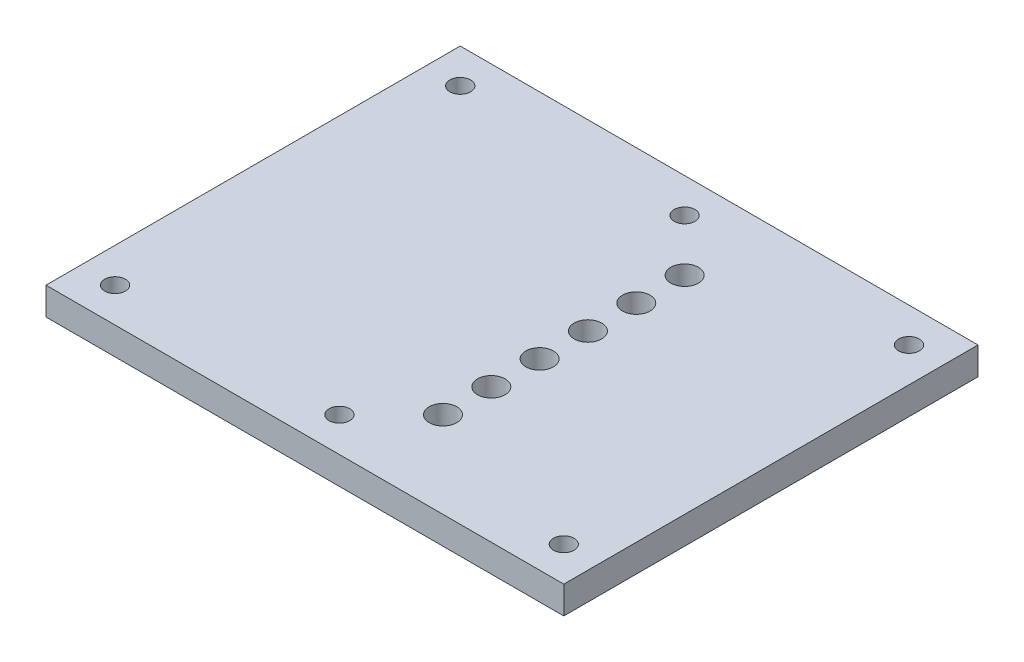
ISO-10303-21;
HEADER;
FILE_DESCRIPTION(('STEP AP214'),'2;1');
FILE_NAME('part.step','',(''),(''),'','','');
FILE_SCHEMA(('AUTOMOTIVE_DESIGN { 1 0 10303 214 1 1 1 1 }'));
ENDSEC;
DATA;
#1=APPLICATION_CONTEXT('core data for automotive mechanical design processes');
#2=APPLICATION_PROTOCOL_DEFINITION('international standard','automotive_design',2000,#1);
#3=PRODUCT_CONTEXT('',#1,'mechanical');
#4=PRODUCT('Part','Part','',(#3));
#5=PRODUCT_RELATED_PRODUCT_CATEGORY('part','',(#4));
#6=PRODUCT_DEFINITION_FORMATION('','',#4);
#7=PRODUCT_DEFINITION_CONTEXT('part definition',#1,'design');
#8=PRODUCT_DEFINITION('design','',#6,#7);
#9=PRODUCT_DEFINITION_SHAPE('','',#8);
#10=(LENGTH_UNIT() NAMED_UNIT(*) SI_UNIT(.MILLI.,.METRE.));
#11=(NAMED_UNIT(*) PLANE_ANGLE_UNIT() SI_UNIT($,.RADIAN.));
#12=(NAMED_UNIT(*) SI_UNIT($,.STERADIAN.) SOLID_ANGLE_UNIT());
#13=UNCERTAINTY_MEASURE_WITH_UNIT(LENGTH_MEASURE(1.E-05),#10,'distance_accuracy_value','');
#14=(GEOMETRIC_REPRESENTATION_CONTEXT(3) GLOBAL_UNCERTAINTY_ASSIGNED_CONTEXT((#13)) GLOBAL_UNIT_ASSIGNED_CONTEXT((#10,
#11,#12)) REPRESENTATION_CONTEXT('',''));
#15=CARTESIAN_POINT('',(0.,0.,0.));
#16=DIRECTION('',(0.,0.,1.));
#17=DIRECTION('',(1.,0.,0.));
#18=AXIS2_PLACEMENT_3D('',#15,#16,#17);
#19=CARTESIAN_POINT('',(37.5,4.,-30.));
#20=DIRECTION('',(-1.,0.,0.));
#21=DIRECTION('',(0.,0.,1.));
#22=AXIS2_PLACEMENT_3D('',#19,#20,#21);
#23=PLANE('',#22);
#24=DIRECTION('',(0.,0.,-1.));
#25=VECTOR('',#24,1.);
#26=CARTESIAN_POINT('',(37.5,0.,-30.));
#27=LINE('',#26,#25);
#28=CARTESIAN_POINT('',(37.5,0.,30.));
#29=VERTEX_POINT('',#28);
#30=CARTESIAN_POINT('',(37.5,0.,-30.));
#31=VERTEX_POINT('',#30);
#32=EDGE_CURVE('E95',#29,#31,#27,.T.);
#33=ORIENTED_EDGE('',*,*,#32,.T.);
#34=DIRECTION('',(0.,-1.,0.));
#35=VECTOR('',#34,1.);
#36=CARTESIAN_POINT('',(37.5,4.,-30.));
#37=LINE('',#36,#35);
#38=CARTESIAN_POINT('',(37.5,4.,-30.));
#39=VERTEX_POINT('',#38);
#40=EDGE_CURVE('E11',#39,#31,#37,.T.);
#41=ORIENTED_EDGE('',*,*,#40,.F.);
#42=DIRECTION('',(0.,0.,-1.));
#43=VECTOR('',#42,1.);
#44=CARTESIAN_POINT('',(37.5,4.,-30.));
#45=LINE('',#44,#43);
#46=CARTESIAN_POINT('',(37.5,4.,30.));
#47=VERTEX_POINT('',#46);
#48=EDGE_CURVE('E83',#47,#39,#45,.T.);
#49=ORIENTED_EDGE('',*,*,#48,.F.);
#50=DIRECTION('',(0.,-1.,0.));
#51=VECTOR('',#50,1.);
#52=CARTESIAN_POINT('',(37.5,4.,30.));
#53=LINE('',#52,#51);
#54=EDGE_CURVE('E91',#47,#29,#53,.T.);
#55=ORIENTED_EDGE('',*,*,#54,.T.);
#56=EDGE_LOOP('',(#33,#41,#49,#55));
#57=FACE_BOUND('',#56,.T.);
#58=ADVANCED_FACE('F32',(#57),#23,.F.);
#59=CARTESIAN_POINT('',(-37.5,4.,-30.));
#60=DIRECTION('',(0.,0.,1.));
#61=DIRECTION('',(1.,0.,0.));
#62=AXIS2_PLACEMENT_3D('',#59,#60,#61);
#63=PLANE('',#62);
#64=DIRECTION('',(-1.,0.,0.));
#65=VECTOR('',#64,1.);
#66=CARTESIAN_POINT('',(-37.5,0.,-30.));
#67=LINE('',#66,#65);
#68=CARTESIAN_POINT('',(-37.5,0.,-30.));
#69=VERTEX_POINT('',#68);
#70=EDGE_CURVE('E87',#31,#69,#67,.T.);
#71=ORIENTED_EDGE('',*,*,#70,.T.);
#72=DIRECTION('',(0.,-1.,0.));
#73=VECTOR('',#72,1.);
#74=CARTESIAN_POINT('',(-37.5,4.,-30.));
#75=LINE('',#74,#73);
#76=CARTESIAN_POINT('',(-37.5,4.,-30.));
#77=VERTEX_POINT('',#76);
#78=EDGE_CURVE('E40',#77,#69,#75,.T.);
#79=ORIENTED_EDGE('',*,*,#78,.F.);
#80=DIRECTION('',(-1.,0.,0.));
#81=VECTOR('',#80,1.);
#82=CARTESIAN_POINT('',(-37.5,4.,-30.));
#83=LINE('',#82,#81);
#84=EDGE_CURVE('E78',#39,#77,#83,.T.);
#85=ORIENTED_EDGE('',*,*,#84,.F.);
#86=ORIENTED_EDGE('',*,*,#40,.T.);
#87=EDGE_LOOP('',(#71,#79,#85,#86));
#88=FACE_BOUND('',#87,.T.);
#89=ADVANCED_FACE('F86',(#88),#63,.F.);
#90=CARTESIAN_POINT('',(-37.5,4.,-30.));
#91=DIRECTION('',(1.,0.,0.));
#92=DIRECTION('',(0.,0.,-1.));
#93=AXIS2_PLACEMENT_3D('',#90,#91,#92);
#94=PLANE('',#93);
#95=DIRECTION('',(0.,0.,1.));
#96=VECTOR('',#95,1.);
#97=CARTESIAN_POINT('',(-37.5,0.,-30.));
#98=LINE('',#97,#96);
#99=CARTESIAN_POINT('',(-37.5,0.,30.));
#100=VERTEX_POINT('',#99);
#101=EDGE_CURVE('E65',#69,#100,#98,.T.);
#102=ORIENTED_EDGE('',*,*,#101,.T.);
#103=DIRECTION('',(0.,-1.,0.));
#104=VECTOR('',#103,1.);
#105=CARTESIAN_POINT('',(-37.5,4.,30.));
#106=LINE('',#105,#104);
#107=CARTESIAN_POINT('',(-37.5,4.,30.));
#108=VERTEX_POINT('',#107);
#109=EDGE_CURVE('E88',#108,#100,#106,.T.);
#110=ORIENTED_EDGE('',*,*,#109,.F.);
#111=DIRECTION('',(0.,0.,1.));
#112=VECTOR('',#111,1.);
#113=CARTESIAN_POINT('',(-37.5,4.,-30.));
#114=LINE('',#113,#112);
#115=EDGE_CURVE('E81',#77,#108,#114,.T.);
#116=ORIENTED_EDGE('',*,*,#115,.F.);
#117=ORIENTED_EDGE('',*,*,#78,.T.);
#118=EDGE_LOOP('',(#102,#110,#116,#117));
#119=FACE_BOUND('',#118,.T.);
#120=ADVANCED_FACE('F89',(#119),#94,.F.);
#121=CARTESIAN_POINT('',(-37.5,4.,30.));
#122=DIRECTION('',(0.,0.,-1.));
#123=DIRECTION('',(-1.,0.,0.));
#124=AXIS2_PLACEMENT_3D('',#121,#122,#123);
#125=PLANE('',#124);
#126=DIRECTION('',(1.,0.,0.));
#127=VECTOR('',#126,1.);
#128=CARTESIAN_POINT('',(-37.5,0.,30.));
#129=LINE('',#128,#127);
#130=EDGE_CURVE('E71',#100,#29,#129,.T.);
#131=ORIENTED_EDGE('',*,*,#130,.T.);
#132=ORIENTED_EDGE('',*,*,#54,.F.);
#133=DIRECTION('',(1.,0.,0.));
#134=VECTOR('',#133,1.);
#135=CARTESIAN_POINT('',(-37.5,4.,30.));
#136=LINE('',#135,#134);
#137=EDGE_CURVE('E48',#108,#47,#136,.T.);
#138=ORIENTED_EDGE('',*,*,#137,.F.);
#139=ORIENTED_EDGE('',*,*,#109,.T.);
#140=EDGE_LOOP('',(#131,#132,#138,#139));
#141=FACE_BOUND('',#140,.T.);
#142=ADVANCED_FACE('F103',(#141),#125,.F.);
#143=CARTESIAN_POINT('',(0.,4.,0.));
#144=DIRECTION('',(0.,1.,0.));
#145=DIRECTION('',(0.,0.,1.));
#146=AXIS2_PLACEMENT_3D('',#143,#144,#145);
#147=PLANE('',#146);
#148=CARTESIAN_POINT('',(32.5,4.,-25.));
#149=DIRECTION('',(0.,1.,0.));
#150=DIRECTION('',(0.,0.,-1.));
#151=AXIS2_PLACEMENT_3D('',#148,#149,#150);
#152=CIRCLE('',#151,1.5);
#153=CARTESIAN_POINT('',(32.5,4.,-26.5));
#154=VERTEX_POINT('',#153);
#155=EDGE_CURVE('E148',#154,#154,#152,.T.);
#156=ORIENTED_EDGE('',*,*,#155,.F.);
#157=EDGE_LOOP('',(#156));
#158=FACE_BOUND('',#157,.T.);
#159=CARTESIAN_POINT('',(32.5,4.,25.));
#160=DIRECTION('',(0.,1.,0.));
#161=DIRECTION('',(0.,0.,1.));
#162=AXIS2_PLACEMENT_3D('',#159,#160,#161);
#163=CIRCLE('',#162,1.5);
#164=CARTESIAN_POINT('',(32.5,4.,26.5));
#165=VERTEX_POINT('',#164);
#166=EDGE_CURVE('E167',#165,#165,#163,.T.);
#167=ORIENTED_EDGE('',*,*,#166,.F.);
#168=EDGE_LOOP('',(#167));
#169=FACE_BOUND('',#168,.T.);
#170=CARTESIAN_POINT('',(-32.5,4.,25.));
#171=DIRECTION('',(0.,1.,0.));
#172=DIRECTION('',(0.,0.,-1.));
#173=AXIS2_PLACEMENT_3D('',#170,#171,#172);
#174=CIRCLE('',#173,1.5);
#175=CARTESIAN_POINT('',(-32.5,4.,23.5));
#176=VERTEX_POINT('',#175);
#177=EDGE_CURVE('E161',#176,#176,#174,.T.);
#178=ORIENTED_EDGE('',*,*,#177,.F.);
#179=EDGE_LOOP('',(#178));
#180=FACE_BOUND('',#179,.T.);
#181=CARTESIAN_POINT('',(0.,4.,25.));
#182=DIRECTION('',(0.,1.,0.));
#183=DIRECTION('',(0.,0.,-1.));
#184=AXIS2_PLACEMENT_3D('',#181,#182,#183);
#185=CIRCLE('',#184,1.5);
#186=CARTESIAN_POINT('',(0.,4.,23.5));
#187=VERTEX_POINT('',#186);
#188=EDGE_CURVE('E154',#187,#187,#185,.T.);
#189=ORIENTED_EDGE('',*,*,#188,.F.);
#190=EDGE_LOOP('',(#189));
#191=FACE_BOUND('',#190,.T.);
#192=CARTESIAN_POINT('',(0.,4.,-25.));
#193=DIRECTION('',(0.,1.,0.));
#194=DIRECTION('',(0.,0.,1.));
#195=AXIS2_PLACEMENT_3D('',#192,#193,#194);
#196=CIRCLE('',#195,1.5);
#197=CARTESIAN_POINT('',(0.,4.,-23.5));
#198=VERTEX_POINT('',#197);
#199=EDGE_CURVE('E155',#198,#198,#196,.T.);
#200=ORIENTED_EDGE('',*,*,#199,.F.);
#201=EDGE_LOOP('',(#200));
#202=FACE_BOUND('',#201,.T.);
#203=CARTESIAN_POINT('',(-32.5,4.,-25.));
#204=DIRECTION('',(0.,1.,0.));
#205=DIRECTION('',(0.,0.,1.));
#206=AXIS2_PLACEMENT_3D('',#203,#204,#205);
#207=CIRCLE('',#206,1.5);
#208=CARTESIAN_POINT('',(-32.5,4.,-23.5));
#209=VERTEX_POINT('',#208);
#210=EDGE_CURVE('E113',#209,#209,#207,.T.);
#211=ORIENTED_EDGE('',*,*,#210,.F.);
#212=EDGE_LOOP('',(#211));
#213=FACE_BOUND('',#212,.T.);
#214=CARTESIAN_POINT('',(7.49999999999999,4.,-17.5));
#215=DIRECTION('',(0.,1.,0.));
#216=DIRECTION('',(0.,0.,1.));
#217=AXIS2_PLACEMENT_3D('',#214,#215,#216);
#218=CIRCLE('',#217,2.);
#219=CARTESIAN_POINT('',(7.49999999999999,4.,-15.5));
#220=VERTEX_POINT('',#219);
#221=EDGE_CURVE('E98',#220,#220,#218,.T.);
#222=ORIENTED_EDGE('',*,*,#221,.F.);
#223=EDGE_LOOP('',(#222));
#224=FACE_BOUND('',#223,.T.);
#225=CARTESIAN_POINT('',(7.50000000000007,4.,-10.5));
#226=DIRECTION('',(0.,1.,0.));
#227=DIRECTION('',(0.,0.,1.));
#228=AXIS2_PLACEMENT_3D('',#225,#226,#227);
#229=CIRCLE('',#228,1.99999999999999);
#230=CARTESIAN_POINT('',(7.50000000000007,4.,-8.50000000000001));
#231=VERTEX_POINT('',#230);
#232=EDGE_CURVE('E137',#231,#231,#229,.T.);
#233=ORIENTED_EDGE('',*,*,#232,.F.);
#234=EDGE_LOOP('',(#233));
#235=FACE_BOUND('',#234,.T.);
#236=CARTESIAN_POINT('',(7.50000000000014,4.,-3.5));
#237=DIRECTION('',(0.,1.,0.));
#238=DIRECTION('',(0.,0.,1.));
#239=AXIS2_PLACEMENT_3D('',#236,#237,#238);
#240=CIRCLE('',#239,2.);
#241=CARTESIAN_POINT('',(7.50000000000014,4.,-1.50000000000001));
#242=VERTEX_POINT('',#241);
#243=EDGE_CURVE('E131',#242,#242,#240,.T.);
#244=ORIENTED_EDGE('',*,*,#243,.F.);
#245=EDGE_LOOP('',(#244));
#246=FACE_BOUND('',#245,.T.);
#247=CARTESIAN_POINT('',(7.50000000000021,4.,3.5));
#248=DIRECTION('',(0.,1.,0.));
#249=DIRECTION('',(0.,0.,1.));
#250=AXIS2_PLACEMENT_3D('',#247,#248,#249);
#251=CIRCLE('',#250,2.);
#252=CARTESIAN_POINT('',(7.50000000000021,4.,5.5));
#253=VERTEX_POINT('',#252);
#254=EDGE_CURVE('E125',#253,#253,#251,.T.);
#255=ORIENTED_EDGE('',*,*,#254,.F.);
#256=EDGE_LOOP('',(#255));
#257=FACE_BOUND('',#256,.T.);
#258=CARTESIAN_POINT('',(7.50000000000029,4.,10.5));
#259=DIRECTION('',(0.,1.,0.));
#260=DIRECTION('',(0.,0.,1.));
#261=AXIS2_PLACEMENT_3D('',#258,#259,#260);
#262=CIRCLE('',#261,2.);
#263=CARTESIAN_POINT('',(7.50000000000029,4.,12.5));
#264=VERTEX_POINT('',#263);
#265=EDGE_CURVE('E119',#264,#264,#262,.T.);
#266=ORIENTED_EDGE('',*,*,#265,.F.);
#267=EDGE_LOOP('',(#266));
#268=FACE_BOUND('',#267,.T.);
#269=CARTESIAN_POINT('',(7.50000000000036,4.,17.5));
#270=DIRECTION('',(0.,1.,0.));
#271=DIRECTION('',(0.,0.,1.));
#272=AXIS2_PLACEMENT_3D('',#269,#270,#271);
#273=CIRCLE('',#272,1.99999999999999);
#274=CARTESIAN_POINT('',(7.50000000000036,4.,19.5));
#275=VERTEX_POINT('',#274);
#276=EDGE_CURVE('E112',#275,#275,#273,.T.);
#277=ORIENTED_EDGE('',*,*,#276,.F.);
#278=EDGE_LOOP('',(#277));
#279=FACE_BOUND('',#278,.T.);
#280=ORIENTED_EDGE('',*,*,#48,.T.);
#281=ORIENTED_EDGE('',*,*,#84,.T.);
#282=ORIENTED_EDGE('',*,*,#115,.T.);
#283=ORIENTED_EDGE('',*,*,#137,.T.);
#284=EDGE_LOOP('',(#280,#281,#282,#283));
#285=FACE_BOUND('',#284,.T.);
#286=ADVANCED_FACE('F79',(#158,#169,#180,#191,#202,#213,#224,#235,#246,#257,#268,#279,#285),
#147,.T.);
#287=CARTESIAN_POINT('',(0.,0.,0.));
#288=DIRECTION('',(0.,1.,0.));
#289=DIRECTION('',(0.,0.,1.));
#290=AXIS2_PLACEMENT_3D('',#287,#288,#289);
#291=PLANE('',#290);
#292=CARTESIAN_POINT('',(32.5,0.,-25.));
#293=DIRECTION('',(0.,1.,0.));
#294=DIRECTION('',(0.,0.,-1.));
#295=AXIS2_PLACEMENT_3D('',#292,#293,#294);
#296=CIRCLE('',#295,1.5);
#297=CARTESIAN_POINT('',(32.5,0.,-26.5));
#298=VERTEX_POINT('',#297);
#299=EDGE_CURVE('E170',#298,#298,#296,.T.);
#300=ORIENTED_EDGE('',*,*,#299,.T.);
#301=EDGE_LOOP('',(#300));
#302=FACE_BOUND('',#301,.T.);
#303=CARTESIAN_POINT('',(32.5,0.,25.));
#304=DIRECTION('',(0.,1.,0.));
#305=DIRECTION('',(0.,0.,1.));
#306=AXIS2_PLACEMENT_3D('',#303,#304,#305);
#307=CIRCLE('',#306,1.5);
#308=CARTESIAN_POINT('',(32.5,0.,26.5));
#309=VERTEX_POINT('',#308);
#310=EDGE_CURVE('E164',#309,#309,#307,.T.);
#311=ORIENTED_EDGE('',*,*,#310,.T.);
#312=EDGE_LOOP('',(#311));
#313=FACE_BOUND('',#312,.T.);
#314=CARTESIAN_POINT('',(-32.5,0.,25.));
#315=DIRECTION('',(0.,1.,0.));
#316=DIRECTION('',(0.,0.,-1.));
#317=AXIS2_PLACEMENT_3D('',#314,#315,#316);
#318=CIRCLE('',#317,1.5);
#319=CARTESIAN_POINT('',(-32.5,0.,23.5));
#320=VERTEX_POINT('',#319);
#321=EDGE_CURVE('E158',#320,#320,#318,.T.);
#322=ORIENTED_EDGE('',*,*,#321,.T.);
#323=EDGE_LOOP('',(#322));
#324=FACE_BOUND('',#323,.T.);
#325=CARTESIAN_POINT('',(0.,0.,25.));
#326=DIRECTION('',(0.,1.,0.));
#327=DIRECTION('',(0.,0.,-1.));
#328=AXIS2_PLACEMENT_3D('',#325,#326,#327);
#329=CIRCLE('',#328,1.5);
#330=CARTESIAN_POINT('',(0.,0.,23.5));
#331=VERTEX_POINT('',#330);
#332=EDGE_CURVE('E151',#331,#331,#329,.T.);
#333=ORIENTED_EDGE('',*,*,#332,.T.);
#334=EDGE_LOOP('',(#333));
#335=FACE_BOUND('',#334,.T.);
#336=CARTESIAN_POINT('',(0.,0.,-25.));
#337=DIRECTION('',(0.,1.,0.));
#338=DIRECTION('',(0.,0.,1.));
#339=AXIS2_PLACEMENT_3D('',#336,#337,#338);
#340=CIRCLE('',#339,1.5);
#341=CARTESIAN_POINT('',(0.,0.,-23.5));
#342=VERTEX_POINT('',#341);
#343=EDGE_CURVE('E175',#342,#342,#340,.T.);
#344=ORIENTED_EDGE('',*,*,#343,.T.);
#345=EDGE_LOOP('',(#344));
#346=FACE_BOUND('',#345,.T.);
#347=CARTESIAN_POINT('',(-32.5,0.,-25.));
#348=DIRECTION('',(0.,1.,0.));
#349=DIRECTION('',(0.,0.,1.));
#350=AXIS2_PLACEMENT_3D('',#347,#348,#349);
#351=CIRCLE('',#350,1.5);
#352=CARTESIAN_POINT('',(-32.5,0.,-23.5));
#353=VERTEX_POINT('',#352);
#354=EDGE_CURVE('E145',#353,#353,#351,.T.);
#355=ORIENTED_EDGE('',*,*,#354,.T.);
#356=EDGE_LOOP('',(#355));
#357=FACE_BOUND('',#356,.T.);
#358=CARTESIAN_POINT('',(7.49999999999999,0.,-17.5));
#359=DIRECTION('',(0.,1.,0.));
#360=DIRECTION('',(0.,0.,1.));
#361=AXIS2_PLACEMENT_3D('',#358,#359,#360);
#362=CIRCLE('',#361,2.);
#363=CARTESIAN_POINT('',(7.49999999999999,0.,-15.5));
#364=VERTEX_POINT('',#363);
#365=EDGE_CURVE('E140',#364,#364,#362,.T.);
#366=ORIENTED_EDGE('',*,*,#365,.T.);
#367=EDGE_LOOP('',(#366));
#368=FACE_BOUND('',#367,.T.);
#369=CARTESIAN_POINT('',(7.50000000000007,0.,-10.5));
#370=DIRECTION('',(0.,1.,0.));
#371=DIRECTION('',(0.,0.,1.));
#372=AXIS2_PLACEMENT_3D('',#369,#370,#371);
#373=CIRCLE('',#372,1.99999999999999);
#374=CARTESIAN_POINT('',(7.50000000000007,0.,-8.50000000000001));
#375=VERTEX_POINT('',#374);
#376=EDGE_CURVE('E134',#375,#375,#373,.T.);
#377=ORIENTED_EDGE('',*,*,#376,.T.);
#378=EDGE_LOOP('',(#377));
#379=FACE_BOUND('',#378,.T.);
#380=CARTESIAN_POINT('',(7.50000000000014,0.,-3.5));
#381=DIRECTION('',(0.,1.,0.));
#382=DIRECTION('',(0.,0.,1.));
#383=AXIS2_PLACEMENT_3D('',#380,#381,#382);
#384=CIRCLE('',#383,2.);
#385=CARTESIAN_POINT('',(7.50000000000014,0.,-1.50000000000001));
#386=VERTEX_POINT('',#385);
#387=EDGE_CURVE('E128',#386,#386,#384,.T.);
#388=ORIENTED_EDGE('',*,*,#387,.T.);
#389=EDGE_LOOP('',(#388));
#390=FACE_BOUND('',#389,.T.);
#391=CARTESIAN_POINT('',(7.50000000000021,0.,3.5));
#392=DIRECTION('',(0.,1.,0.));
#393=DIRECTION('',(0.,0.,1.));
#394=AXIS2_PLACEMENT_3D('',#391,#392,#393);
#395=CIRCLE('',#394,2.);
#396=CARTESIAN_POINT('',(7.50000000000021,0.,5.5));
#397=VERTEX_POINT('',#396);
#398=EDGE_CURVE('E122',#397,#397,#395,.T.);
#399=ORIENTED_EDGE('',*,*,#398,.T.);
#400=EDGE_LOOP('',(#399));
#401=FACE_BOUND('',#400,.T.);
#402=CARTESIAN_POINT('',(7.50000000000029,0.,10.5));
#403=DIRECTION('',(0.,1.,0.));
#404=DIRECTION('',(0.,0.,1.));
#405=AXIS2_PLACEMENT_3D('',#402,#403,#404);
#406=CIRCLE('',#405,2.);
#407=CARTESIAN_POINT('',(7.50000000000029,0.,12.5));
#408=VERTEX_POINT('',#407);
#409=EDGE_CURVE('E116',#408,#408,#406,.T.);
#410=ORIENTED_EDGE('',*,*,#409,.T.);
#411=EDGE_LOOP('',(#410));
#412=FACE_BOUND('',#411,.T.);
#413=CARTESIAN_POINT('',(7.50000000000036,0.,17.5));
#414=DIRECTION('',(0.,1.,0.));
#415=DIRECTION('',(0.,0.,1.));
#416=AXIS2_PLACEMENT_3D('',#413,#414,#415);
#417=CIRCLE('',#416,1.99999999999999);
#418=CARTESIAN_POINT('',(7.50000000000036,0.,19.5));
#419=VERTEX_POINT('',#418);
#420=EDGE_CURVE('E109',#419,#419,#417,.T.);
#421=ORIENTED_EDGE('',*,*,#420,.T.);
#422=EDGE_LOOP('',(#421));
#423=FACE_BOUND('',#422,.T.);
#424=ORIENTED_EDGE('',*,*,#32,.F.);
#425=ORIENTED_EDGE('',*,*,#130,.F.);
#426=ORIENTED_EDGE('',*,*,#101,.F.);
#427=ORIENTED_EDGE('',*,*,#70,.F.);
#428=EDGE_LOOP('',(#424,#425,#426,#427));
#429=FACE_BOUND('',#428,.T.);
#430=ADVANCED_FACE('F106',(#302,#313,#324,#335,#346,#357,#368,#379,#390,#401,#412,#423,#429),
#291,.F.);
#431=CARTESIAN_POINT('',(7.50000000000036,4.,17.5));
#432=DIRECTION('',(0.,-1.,0.));
#433=DIRECTION('',(0.,0.,-1.));
#434=AXIS2_PLACEMENT_3D('',#431,#432,#433);
#435=CYLINDRICAL_SURFACE('',#434,1.99999999999999);
#436=ORIENTED_EDGE('',*,*,#276,.T.);
#437=EDGE_LOOP('',(#436));
#438=FACE_BOUND('',#437,.T.);
#439=ORIENTED_EDGE('',*,*,#420,.F.);
#440=EDGE_LOOP('',(#439));
#441=FACE_BOUND('',#440,.T.);
#442=ADVANCED_FACE('F202',(#438,#441),#435,.F.);
#443=CARTESIAN_POINT('',(7.50000000000029,4.,10.5));
#444=DIRECTION('',(0.,-1.,0.));
#445=DIRECTION('',(0.,0.,-1.));
#446=AXIS2_PLACEMENT_3D('',#443,#444,#445);
#447=CYLINDRICAL_SURFACE('',#446,2.);
#448=ORIENTED_EDGE('',*,*,#265,.T.);
#449=EDGE_LOOP('',(#448));
#450=FACE_BOUND('',#449,.T.);
#451=ORIENTED_EDGE('',*,*,#409,.F.);
#452=EDGE_LOOP('',(#451));
#453=FACE_BOUND('',#452,.T.);
#454=ADVANCED_FACE('F205',(#450,#453),#447,.F.);
#455=CARTESIAN_POINT('',(7.50000000000021,4.,3.5));
#456=DIRECTION('',(0.,-1.,0.));
#457=DIRECTION('',(0.,0.,-1.));
#458=AXIS2_PLACEMENT_3D('',#455,#456,#457);
#459=CYLINDRICAL_SURFACE('',#458,2.);
#460=ORIENTED_EDGE('',*,*,#254,.T.);
#461=EDGE_LOOP('',(#460));
#462=FACE_BOUND('',#461,.T.);
#463=ORIENTED_EDGE('',*,*,#398,.F.);
#464=EDGE_LOOP('',(#463));
#465=FACE_BOUND('',#464,.T.);
#466=ADVANCED_FACE('F318',(#462,#465),#459,.F.);
#467=CARTESIAN_POINT('',(7.50000000000014,4.,-3.5));
#468=DIRECTION('',(0.,-1.,0.));
#469=DIRECTION('',(0.,0.,-1.));
#470=AXIS2_PLACEMENT_3D('',#467,#468,#469);
#471=CYLINDRICAL_SURFACE('',#470,2.);
#472=ORIENTED_EDGE('',*,*,#243,.T.);
#473=EDGE_LOOP('',(#472));
#474=FACE_BOUND('',#473,.T.);
#475=ORIENTED_EDGE('',*,*,#387,.F.);
#476=EDGE_LOOP('',(#475));
#477=FACE_BOUND('',#476,.T.);
#478=ADVANCED_FACE('F314',(#474,#477),#471,.F.);
#479=CARTESIAN_POINT('',(7.50000000000007,4.,-10.5));
#480=DIRECTION('',(0.,-1.,0.));
#481=DIRECTION('',(0.,0.,-1.));
#482=AXIS2_PLACEMENT_3D('',#479,#480,#481);
#483=CYLINDRICAL_SURFACE('',#482,1.99999999999999);
#484=ORIENTED_EDGE('',*,*,#232,.T.);
#485=EDGE_LOOP('',(#484));
#486=FACE_BOUND('',#485,.T.);
#487=ORIENTED_EDGE('',*,*,#376,.F.);
#488=EDGE_LOOP('',(#487));
#489=FACE_BOUND('',#488,.T.);
#490=ADVANCED_FACE('F310',(#486,#489),#483,.F.);
#491=CARTESIAN_POINT('',(7.49999999999999,4.,-17.5));
#492=DIRECTION('',(0.,-1.,0.));
#493=DIRECTION('',(0.,0.,-1.));
#494=AXIS2_PLACEMENT_3D('',#491,#492,#493);
#495=CYLINDRICAL_SURFACE('',#494,2.);
#496=ORIENTED_EDGE('',*,*,#221,.T.);
#497=EDGE_LOOP('',(#496));
#498=FACE_BOUND('',#497,.T.);
#499=ORIENTED_EDGE('',*,*,#365,.F.);
#500=EDGE_LOOP('',(#499));
#501=FACE_BOUND('',#500,.T.);
#502=ADVANCED_FACE('F240',(#498,#501),#495,.F.);
#503=CARTESIAN_POINT('',(-32.5,4.,-25.));
#504=DIRECTION('',(0.,-1.,0.));
#505=DIRECTION('',(0.,0.,-1.));
#506=AXIS2_PLACEMENT_3D('',#503,#504,#505);
#507=CYLINDRICAL_SURFACE('',#506,1.5);
#508=ORIENTED_EDGE('',*,*,#210,.T.);
#509=EDGE_LOOP('',(#508));
#510=FACE_BOUND('',#509,.T.);
#511=ORIENTED_EDGE('',*,*,#354,.F.);
#512=EDGE_LOOP('',(#511));
#513=FACE_BOUND('',#512,.T.);
#514=ADVANCED_FACE('F250',(#510,#513),#507,.F.);
#515=CARTESIAN_POINT('',(0.,4.,-25.));
#516=DIRECTION('',(0.,-1.,0.));
#517=DIRECTION('',(0.,0.,-1.));
#518=AXIS2_PLACEMENT_3D('',#515,#516,#517);
#519=CYLINDRICAL_SURFACE('',#518,1.5);
#520=ORIENTED_EDGE('',*,*,#199,.T.);
#521=EDGE_LOOP('',(#520));
#522=FACE_BOUND('',#521,.T.);
#523=ORIENTED_EDGE('',*,*,#343,.F.);
#524=EDGE_LOOP('',(#523));
#525=FACE_BOUND('',#524,.T.);
#526=ADVANCED_FACE('F181',(#522,#525),#519,.F.);
#527=CARTESIAN_POINT('',(0.,4.,25.));
#528=DIRECTION('',(0.,-1.,0.));
#529=DIRECTION('',(0.,0.,-1.));
#530=AXIS2_PLACEMENT_3D('',#527,#528,#529);
#531=CYLINDRICAL_SURFACE('',#530,1.5);
#532=ORIENTED_EDGE('',*,*,#188,.T.);
#533=EDGE_LOOP('',(#532));
#534=FACE_BOUND('',#533,.T.);
#535=ORIENTED_EDGE('',*,*,#332,.F.);
#536=EDGE_LOOP('',(#535));
#537=FACE_BOUND('',#536,.T.);
#538=ADVANCED_FACE('F264',(#534,#537),#531,.F.);
#539=CARTESIAN_POINT('',(-32.5,4.,25.));
#540=DIRECTION('',(0.,-1.,0.));
#541=DIRECTION('',(0.,0.,-1.));
#542=AXIS2_PLACEMENT_3D('',#539,#540,#541);
#543=CYLINDRICAL_SURFACE('',#542,1.5);
#544=ORIENTED_EDGE('',*,*,#177,.T.);
#545=EDGE_LOOP('',(#544));
#546=FACE_BOUND('',#545,.T.);
#547=ORIENTED_EDGE('',*,*,#321,.F.);
#548=EDGE_LOOP('',(#547));
#549=FACE_BOUND('',#548,.T.);
#550=ADVANCED_FACE('F273',(#546,#549),#543,.F.);
#551=CARTESIAN_POINT('',(32.5,4.,25.));
#552=DIRECTION('',(0.,-1.,0.));
#553=DIRECTION('',(0.,0.,-1.));
#554=AXIS2_PLACEMENT_3D('',#551,#552,#553);
#555=CYLINDRICAL_SURFACE('',#554,1.5);
#556=ORIENTED_EDGE('',*,*,#166,.T.);
#557=EDGE_LOOP('',(#556));
#558=FACE_BOUND('',#557,.T.);
#559=ORIENTED_EDGE('',*,*,#310,.F.);
#560=EDGE_LOOP('',(#559));
#561=FACE_BOUND('',#560,.T.);
#562=ADVANCED_FACE('F283',(#558,#561),#555,.F.);
#563=CARTESIAN_POINT('',(32.5,4.,-25.));
#564=DIRECTION('',(0.,-1.,0.));
#565=DIRECTION('',(0.,0.,-1.));
#566=AXIS2_PLACEMENT_3D('',#563,#564,#565);
#567=CYLINDRICAL_SURFACE('',#566,1.5);
#568=ORIENTED_EDGE('',*,*,#155,.T.);
#569=EDGE_LOOP('',(#568));
#570=FACE_BOUND('',#569,.T.);
#571=ORIENTED_EDGE('',*,*,#299,.F.);
#572=EDGE_LOOP('',(#571));
#573=FACE_BOUND('',#572,.T.);
#574=ADVANCED_FACE('F293',(#570,#573),#567,.F.);
#575=CLOSED_SHELL('',(#58,#89,#120,#142,#286,#430,#442,#454,#466,#478,#490,#502,#514,#526,#538,
#550,#562,#574));
#576=MANIFOLD_SOLID_BREP('B2',#575);
#577=ADVANCED_BREP_SHAPE_REPRESENTATION('',(#18,#576),#14);
#578=SHAPE_DEFINITION_REPRESENTATION(#9,#577);
ENDSEC;
END-ISO-10303-21;
